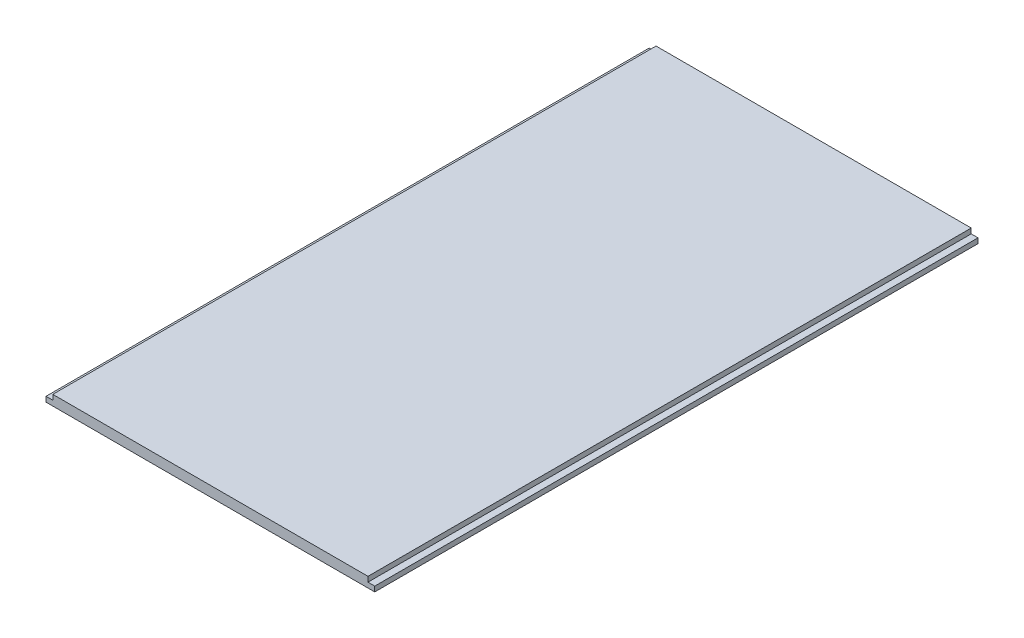
ISO-10303-21;
HEADER;
FILE_DESCRIPTION(('STEP AP214'),'2;1');
FILE_NAME('part.step','',(''),(''),'','','');
FILE_SCHEMA(('AUTOMOTIVE_DESIGN { 1 0 10303 214 1 1 1 1 }'));
ENDSEC;
DATA;
#1=APPLICATION_CONTEXT('core data for automotive mechanical design processes');
#2=APPLICATION_PROTOCOL_DEFINITION('international standard','automotive_design',2000,#1);
#3=PRODUCT_CONTEXT('',#1,'mechanical');
#4=PRODUCT('Part','Part','',(#3));
#5=PRODUCT_RELATED_PRODUCT_CATEGORY('part','',(#4));
#6=PRODUCT_DEFINITION_FORMATION('','',#4);
#7=PRODUCT_DEFINITION_CONTEXT('part definition',#1,'design');
#8=PRODUCT_DEFINITION('design','',#6,#7);
#9=PRODUCT_DEFINITION_SHAPE('','',#8);
#10=(LENGTH_UNIT() NAMED_UNIT(*) SI_UNIT(.MILLI.,.METRE.));
#11=(NAMED_UNIT(*) PLANE_ANGLE_UNIT() SI_UNIT($,.RADIAN.));
#12=(NAMED_UNIT(*) SI_UNIT($,.STERADIAN.) SOLID_ANGLE_UNIT());
#13=UNCERTAINTY_MEASURE_WITH_UNIT(LENGTH_MEASURE(1.E-05),#10,'distance_accuracy_value','');
#14=(GEOMETRIC_REPRESENTATION_CONTEXT(3) GLOBAL_UNCERTAINTY_ASSIGNED_CONTEXT((#13)) GLOBAL_UNIT_ASSIGNED_CONTEXT((#10,
#11,#12)) REPRESENTATION_CONTEXT('',''));
#15=CARTESIAN_POINT('',(0.,0.,0.));
#16=DIRECTION('',(0.,0.,1.));
#17=DIRECTION('',(1.,0.,0.));
#18=AXIS2_PLACEMENT_3D('',#15,#16,#17);
#19=CARTESIAN_POINT('',(-48.5,0.,178.));
#20=DIRECTION('',(1.,0.,0.));
#21=DIRECTION('',(0.,0.,-1.));
#22=AXIS2_PLACEMENT_3D('',#19,#20,#21);
#23=PLANE('',#22);
#24=DIRECTION('',(0.,-1.,0.));
#25=VECTOR('',#24,1.);
#26=CARTESIAN_POINT('',(-48.5,0.,0.));
#27=LINE('',#26,#25);
#28=CARTESIAN_POINT('',(-48.5,1.49999999999999,0.));
#29=VERTEX_POINT('',#28);
#30=CARTESIAN_POINT('',(-48.5,0.,0.));
#31=VERTEX_POINT('',#30);
#32=EDGE_CURVE('E140',#29,#31,#27,.T.);
#33=ORIENTED_EDGE('',*,*,#32,.T.);
#34=DIRECTION('',(0.,0.,-1.));
#35=VECTOR('',#34,1.);
#36=CARTESIAN_POINT('',(-48.5,0.,178.));
#37=LINE('',#36,#35);
#38=CARTESIAN_POINT('',(-48.5,0.,178.));
#39=VERTEX_POINT('',#38);
#40=EDGE_CURVE('E11',#39,#31,#37,.T.);
#41=ORIENTED_EDGE('',*,*,#40,.F.);
#42=DIRECTION('',(0.,-1.,0.));
#43=VECTOR('',#42,1.);
#44=CARTESIAN_POINT('',(-48.5,0.,178.));
#45=LINE('',#44,#43);
#46=CARTESIAN_POINT('',(-48.5,1.49999999999999,178.));
#47=VERTEX_POINT('',#46);
#48=EDGE_CURVE('E162',#47,#39,#45,.T.);
#49=ORIENTED_EDGE('',*,*,#48,.F.);
#50=DIRECTION('',(0.,0.,-1.));
#51=VECTOR('',#50,1.);
#52=CARTESIAN_POINT('',(-48.5,1.49999999999999,178.));
#53=LINE('',#52,#51);
#54=EDGE_CURVE('E136',#47,#29,#53,.T.);
#55=ORIENTED_EDGE('',*,*,#54,.T.);
#56=EDGE_LOOP('',(#33,#41,#49,#55));
#57=FACE_BOUND('',#56,.T.);
#58=ADVANCED_FACE('F39',(#57),#23,.F.);
#59=CARTESIAN_POINT('',(48.5,0.,178.));
#60=DIRECTION('',(0.,1.,0.));
#61=DIRECTION('',(0.,0.,1.));
#62=AXIS2_PLACEMENT_3D('',#59,#60,#61);
#63=PLANE('',#62);
#64=DIRECTION('',(1.,0.,0.));
#65=VECTOR('',#64,1.);
#66=CARTESIAN_POINT('',(48.5,0.,0.));
#67=LINE('',#66,#65);
#68=CARTESIAN_POINT('',(48.5,0.,0.));
#69=VERTEX_POINT('',#68);
#70=EDGE_CURVE('E144',#31,#69,#67,.T.);
#71=ORIENTED_EDGE('',*,*,#70,.T.);
#72=DIRECTION('',(0.,0.,-1.));
#73=VECTOR('',#72,1.);
#74=CARTESIAN_POINT('',(48.5,0.,178.));
#75=LINE('',#74,#73);
#76=CARTESIAN_POINT('',(48.5,0.,178.));
#77=VERTEX_POINT('',#76);
#78=EDGE_CURVE('E48',#77,#69,#75,.T.);
#79=ORIENTED_EDGE('',*,*,#78,.F.);
#80=DIRECTION('',(1.,0.,0.));
#81=VECTOR('',#80,1.);
#82=CARTESIAN_POINT('',(48.5,0.,178.));
#83=LINE('',#82,#81);
#84=EDGE_CURVE('E99',#39,#77,#83,.T.);
#85=ORIENTED_EDGE('',*,*,#84,.F.);
#86=ORIENTED_EDGE('',*,*,#40,.T.);
#87=EDGE_LOOP('',(#71,#79,#85,#86));
#88=FACE_BOUND('',#87,.T.);
#89=ADVANCED_FACE('F208',(#88),#63,.F.);
#90=CARTESIAN_POINT('',(48.5,0.,178.));
#91=DIRECTION('',(-1.,0.,0.));
#92=DIRECTION('',(0.,0.,1.));
#93=AXIS2_PLACEMENT_3D('',#90,#91,#92);
#94=PLANE('',#93);
#95=DIRECTION('',(0.,1.,0.));
#96=VECTOR('',#95,1.);
#97=CARTESIAN_POINT('',(48.5,0.,0.));
#98=LINE('',#97,#96);
#99=CARTESIAN_POINT('',(48.5,1.49999999999999,0.));
#100=VERTEX_POINT('',#99);
#101=EDGE_CURVE('E147',#69,#100,#98,.T.);
#102=ORIENTED_EDGE('',*,*,#101,.T.);
#103=DIRECTION('',(0.,0.,-1.));
#104=VECTOR('',#103,1.);
#105=CARTESIAN_POINT('',(48.5,1.49999999999999,178.));
#106=LINE('',#105,#104);
#107=CARTESIAN_POINT('',(48.5,1.49999999999999,178.));
#108=VERTEX_POINT('',#107);
#109=EDGE_CURVE('E173',#108,#100,#106,.T.);
#110=ORIENTED_EDGE('',*,*,#109,.F.);
#111=DIRECTION('',(0.,1.,0.));
#112=VECTOR('',#111,1.);
#113=CARTESIAN_POINT('',(48.5,0.,178.));
#114=LINE('',#113,#112);
#115=EDGE_CURVE('E183',#77,#108,#114,.T.);
#116=ORIENTED_EDGE('',*,*,#115,.F.);
#117=ORIENTED_EDGE('',*,*,#78,.T.);
#118=EDGE_LOOP('',(#102,#110,#116,#117));
#119=FACE_BOUND('',#118,.T.);
#120=ADVANCED_FACE('F181',(#119),#94,.F.);
#121=CARTESIAN_POINT('',(48.5,1.49999999999999,178.));
#122=DIRECTION('',(0.,-1.,0.));
#123=DIRECTION('',(0.,0.,-1.));
#124=AXIS2_PLACEMENT_3D('',#121,#122,#123);
#125=PLANE('',#124);
#126=DIRECTION('',(-1.,0.,0.));
#127=VECTOR('',#126,1.);
#128=CARTESIAN_POINT('',(48.5,1.49999999999999,0.));
#129=LINE('',#128,#127);
#130=CARTESIAN_POINT('',(46.5,1.49999999999999,0.));
#131=VERTEX_POINT('',#130);
#132=EDGE_CURVE('E150',#100,#131,#129,.T.);
#133=ORIENTED_EDGE('',*,*,#132,.T.);
#134=DIRECTION('',(0.,0.,-1.));
#135=VECTOR('',#134,1.);
#136=CARTESIAN_POINT('',(46.5,1.49999999999999,178.));
#137=LINE('',#136,#135);
#138=CARTESIAN_POINT('',(46.5,1.49999999999999,178.));
#139=VERTEX_POINT('',#138);
#140=EDGE_CURVE('E169',#139,#131,#137,.T.);
#141=ORIENTED_EDGE('',*,*,#140,.F.);
#142=DIRECTION('',(-1.,0.,0.));
#143=VECTOR('',#142,1.);
#144=CARTESIAN_POINT('',(48.5,1.49999999999999,178.));
#145=LINE('',#144,#143);
#146=EDGE_CURVE('E196',#108,#139,#145,.T.);
#147=ORIENTED_EDGE('',*,*,#146,.F.);
#148=ORIENTED_EDGE('',*,*,#109,.T.);
#149=EDGE_LOOP('',(#133,#141,#147,#148));
#150=FACE_BOUND('',#149,.T.);
#151=ADVANCED_FACE('F191',(#150),#125,.F.);
#152=CARTESIAN_POINT('',(46.5,1.49999999999999,178.));
#153=DIRECTION('',(-1.,0.,0.));
#154=DIRECTION('',(0.,0.,1.));
#155=AXIS2_PLACEMENT_3D('',#152,#153,#154);
#156=PLANE('',#155);
#157=DIRECTION('',(0.,1.,0.));
#158=VECTOR('',#157,1.);
#159=CARTESIAN_POINT('',(46.5,1.49999999999999,0.));
#160=LINE('',#159,#158);
#161=CARTESIAN_POINT('',(46.5,2.99999999999999,0.));
#162=VERTEX_POINT('',#161);
#163=EDGE_CURVE('E153',#131,#162,#160,.T.);
#164=ORIENTED_EDGE('',*,*,#163,.T.);
#165=DIRECTION('',(0.,0.,-1.));
#166=VECTOR('',#165,1.);
#167=CARTESIAN_POINT('',(46.5,2.99999999999999,178.));
#168=LINE('',#167,#166);
#169=CARTESIAN_POINT('',(46.5,2.99999999999999,178.));
#170=VERTEX_POINT('',#169);
#171=EDGE_CURVE('E129',#170,#162,#168,.T.);
#172=ORIENTED_EDGE('',*,*,#171,.F.);
#173=DIRECTION('',(0.,1.,0.));
#174=VECTOR('',#173,1.);
#175=CARTESIAN_POINT('',(46.5,1.49999999999999,178.));
#176=LINE('',#175,#174);
#177=EDGE_CURVE('E118',#139,#170,#176,.T.);
#178=ORIENTED_EDGE('',*,*,#177,.F.);
#179=ORIENTED_EDGE('',*,*,#140,.T.);
#180=EDGE_LOOP('',(#164,#172,#178,#179));
#181=FACE_BOUND('',#180,.T.);
#182=ADVANCED_FACE('F194',(#181),#156,.F.);
#183=CARTESIAN_POINT('',(-46.5,2.99999999999999,178.));
#184=DIRECTION('',(0.,-1.,0.));
#185=DIRECTION('',(0.,0.,-1.));
#186=AXIS2_PLACEMENT_3D('',#183,#184,#185);
#187=PLANE('',#186);
#188=DIRECTION('',(-1.,0.,0.));
#189=VECTOR('',#188,1.);
#190=CARTESIAN_POINT('',(-46.5,2.99999999999999,0.));
#191=LINE('',#190,#189);
#192=CARTESIAN_POINT('',(-46.5,2.99999999999999,0.));
#193=VERTEX_POINT('',#192);
#194=EDGE_CURVE('E127',#162,#193,#191,.T.);
#195=ORIENTED_EDGE('',*,*,#194,.T.);
#196=DIRECTION('',(0.,0.,-1.));
#197=VECTOR('',#196,1.);
#198=CARTESIAN_POINT('',(-46.5,2.99999999999999,178.));
#199=LINE('',#198,#197);
#200=CARTESIAN_POINT('',(-46.5,2.99999999999999,178.));
#201=VERTEX_POINT('',#200);
#202=EDGE_CURVE('E124',#201,#193,#199,.T.);
#203=ORIENTED_EDGE('',*,*,#202,.F.);
#204=DIRECTION('',(-1.,0.,0.));
#205=VECTOR('',#204,1.);
#206=CARTESIAN_POINT('',(-46.5,2.99999999999999,178.));
#207=LINE('',#206,#205);
#208=EDGE_CURVE('E112',#170,#201,#207,.T.);
#209=ORIENTED_EDGE('',*,*,#208,.F.);
#210=ORIENTED_EDGE('',*,*,#171,.T.);
#211=EDGE_LOOP('',(#195,#203,#209,#210));
#212=FACE_BOUND('',#211,.T.);
#213=ADVANCED_FACE('F125',(#212),#187,.F.);
#214=CARTESIAN_POINT('',(-46.5,1.49999999999999,178.));
#215=DIRECTION('',(1.,0.,0.));
#216=DIRECTION('',(0.,0.,-1.));
#217=AXIS2_PLACEMENT_3D('',#214,#215,#216);
#218=PLANE('',#217);
#219=DIRECTION('',(0.,-1.,0.));
#220=VECTOR('',#219,1.);
#221=CARTESIAN_POINT('',(-46.5,1.49999999999999,0.));
#222=LINE('',#221,#220);
#223=CARTESIAN_POINT('',(-46.5,1.49999999999999,0.));
#224=VERTEX_POINT('',#223);
#225=EDGE_CURVE('E85',#193,#224,#222,.T.);
#226=ORIENTED_EDGE('',*,*,#225,.T.);
#227=DIRECTION('',(0.,0.,-1.));
#228=VECTOR('',#227,1.);
#229=CARTESIAN_POINT('',(-46.5,1.49999999999999,178.));
#230=LINE('',#229,#228);
#231=CARTESIAN_POINT('',(-46.5,1.49999999999999,178.));
#232=VERTEX_POINT('',#231);
#233=EDGE_CURVE('E130',#232,#224,#230,.T.);
#234=ORIENTED_EDGE('',*,*,#233,.F.);
#235=DIRECTION('',(0.,-1.,0.));
#236=VECTOR('',#235,1.);
#237=CARTESIAN_POINT('',(-46.5,1.49999999999999,178.));
#238=LINE('',#237,#236);
#239=EDGE_CURVE('E116',#201,#232,#238,.T.);
#240=ORIENTED_EDGE('',*,*,#239,.F.);
#241=ORIENTED_EDGE('',*,*,#202,.T.);
#242=EDGE_LOOP('',(#226,#234,#240,#241));
#243=FACE_BOUND('',#242,.T.);
#244=ADVANCED_FACE('F132',(#243),#218,.F.);
#245=CARTESIAN_POINT('',(-48.5,1.49999999999999,178.));
#246=DIRECTION('',(0.,-1.,0.));
#247=DIRECTION('',(0.,0.,-1.));
#248=AXIS2_PLACEMENT_3D('',#245,#246,#247);
#249=PLANE('',#248);
#250=DIRECTION('',(-1.,0.,0.));
#251=VECTOR('',#250,1.);
#252=CARTESIAN_POINT('',(-48.5,1.49999999999999,0.));
#253=LINE('',#252,#251);
#254=EDGE_CURVE('E91',#224,#29,#253,.T.);
#255=ORIENTED_EDGE('',*,*,#254,.T.);
#256=ORIENTED_EDGE('',*,*,#54,.F.);
#257=DIRECTION('',(-1.,0.,0.));
#258=VECTOR('',#257,1.);
#259=CARTESIAN_POINT('',(-48.5,1.49999999999999,178.));
#260=LINE('',#259,#258);
#261=EDGE_CURVE('E56',#232,#47,#260,.T.);
#262=ORIENTED_EDGE('',*,*,#261,.F.);
#263=ORIENTED_EDGE('',*,*,#233,.T.);
#264=EDGE_LOOP('',(#255,#256,#262,#263));
#265=FACE_BOUND('',#264,.T.);
#266=ADVANCED_FACE('F224',(#265),#249,.F.);
#267=CARTESIAN_POINT('',(0.,0.,178.));
#268=DIRECTION('',(0.,0.,-1.));
#269=DIRECTION('',(-1.,0.,0.));
#270=AXIS2_PLACEMENT_3D('',#267,#268,#269);
#271=PLANE('',#270);
#272=ORIENTED_EDGE('',*,*,#48,.T.);
#273=ORIENTED_EDGE('',*,*,#84,.T.);
#274=ORIENTED_EDGE('',*,*,#115,.T.);
#275=ORIENTED_EDGE('',*,*,#146,.T.);
#276=ORIENTED_EDGE('',*,*,#177,.T.);
#277=ORIENTED_EDGE('',*,*,#208,.T.);
#278=ORIENTED_EDGE('',*,*,#239,.T.);
#279=ORIENTED_EDGE('',*,*,#261,.T.);
#280=EDGE_LOOP('',(#272,#273,#274,#275,#276,#277,#278,#279));
#281=FACE_BOUND('',#280,.T.);
#282=ADVANCED_FACE('F114',(#281),#271,.F.);
#283=CARTESIAN_POINT('',(0.,0.,0.));
#284=DIRECTION('',(0.,0.,-1.));
#285=DIRECTION('',(-1.,0.,0.));
#286=AXIS2_PLACEMENT_3D('',#283,#284,#285);
#287=PLANE('',#286);
#288=ORIENTED_EDGE('',*,*,#32,.F.);
#289=ORIENTED_EDGE('',*,*,#254,.F.);
#290=ORIENTED_EDGE('',*,*,#225,.F.);
#291=ORIENTED_EDGE('',*,*,#194,.F.);
#292=ORIENTED_EDGE('',*,*,#163,.F.);
#293=ORIENTED_EDGE('',*,*,#132,.F.);
#294=ORIENTED_EDGE('',*,*,#101,.F.);
#295=ORIENTED_EDGE('',*,*,#70,.F.);
#296=EDGE_LOOP('',(#288,#289,#290,#291,#292,#293,#294,#295));
#297=FACE_BOUND('',#296,.T.);
#298=ADVANCED_FACE('F187',(#297),#287,.T.);
#299=CLOSED_SHELL('',(#58,#89,#120,#151,#182,#213,#244,#266,#282,#298));
#300=MANIFOLD_SOLID_BREP('B2',#299);
#301=ADVANCED_BREP_SHAPE_REPRESENTATION('',(#18,#300),#14);
#302=SHAPE_DEFINITION_REPRESENTATION(#9,#301);
ENDSEC;
END-ISO-10303-21;
